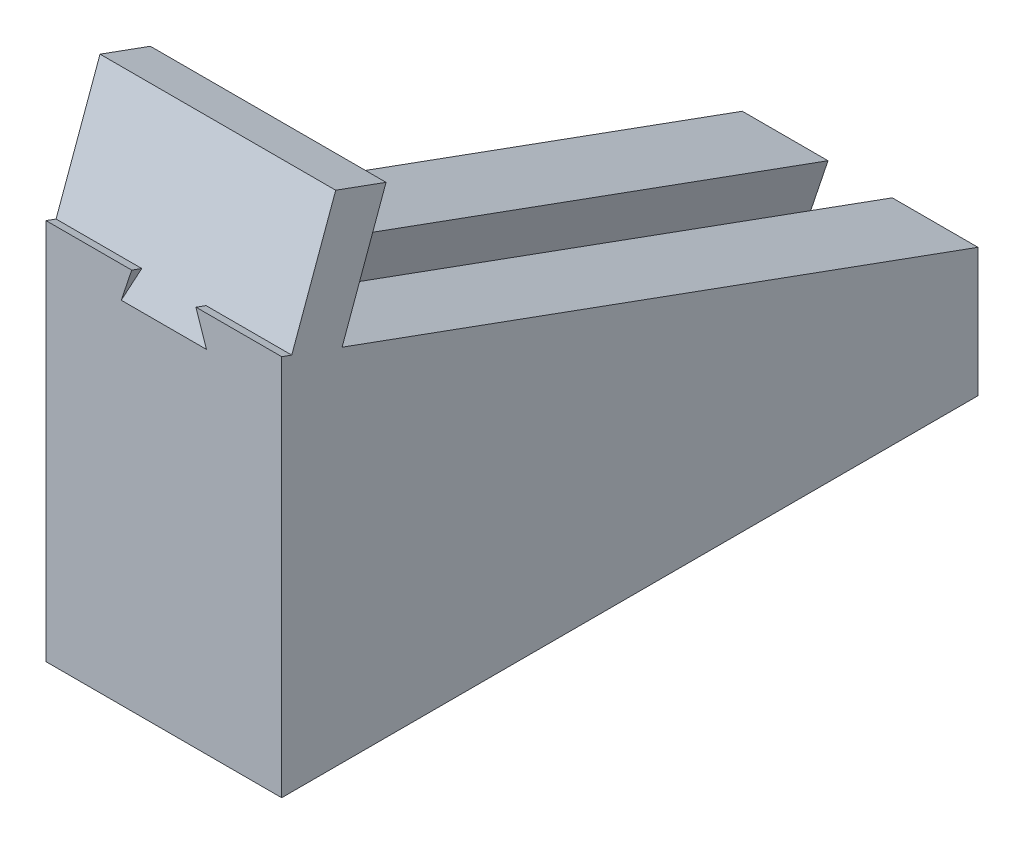
ISO-10303-21;
HEADER;
FILE_DESCRIPTION(('STEP AP214'),'2;1');
FILE_NAME('part.step','',(''),(''),'','','');
FILE_SCHEMA(('AUTOMOTIVE_DESIGN { 1 0 10303 214 1 1 1 1 }'));
ENDSEC;
DATA;
#1=APPLICATION_CONTEXT('core data for automotive mechanical design processes');
#2=APPLICATION_PROTOCOL_DEFINITION('international standard','automotive_design',2000,#1);
#3=PRODUCT_CONTEXT('',#1,'mechanical');
#4=PRODUCT('Part','Part','',(#3));
#5=PRODUCT_RELATED_PRODUCT_CATEGORY('part','',(#4));
#6=PRODUCT_DEFINITION_FORMATION('','',#4);
#7=PRODUCT_DEFINITION_CONTEXT('part definition',#1,'design');
#8=PRODUCT_DEFINITION('design','',#6,#7);
#9=PRODUCT_DEFINITION_SHAPE('','',#8);
#10=(LENGTH_UNIT() NAMED_UNIT(*) SI_UNIT(.MILLI.,.METRE.));
#11=(NAMED_UNIT(*) PLANE_ANGLE_UNIT() SI_UNIT($,.RADIAN.));
#12=(NAMED_UNIT(*) SI_UNIT($,.STERADIAN.) SOLID_ANGLE_UNIT());
#13=UNCERTAINTY_MEASURE_WITH_UNIT(LENGTH_MEASURE(1.E-05),#10,'distance_accuracy_value','');
#14=(GEOMETRIC_REPRESENTATION_CONTEXT(3) GLOBAL_UNCERTAINTY_ASSIGNED_CONTEXT((#13)) GLOBAL_UNIT_ASSIGNED_CONTEXT((#10,
#11,#12)) REPRESENTATION_CONTEXT('',''));
#15=CARTESIAN_POINT('',(0.,0.,0.));
#16=DIRECTION('',(0.,0.,1.));
#17=DIRECTION('',(1.,0.,0.));
#18=AXIS2_PLACEMENT_3D('',#15,#16,#17);
#19=CARTESIAN_POINT('',(-11.,4.71740096382081,-1.71699353392943));
#20=DIRECTION('',(0.,0.939692620785911,-0.342020143325662));
#21=DIRECTION('',(0.,0.342020143325662,0.939692620785911));
#22=AXIS2_PLACEMENT_3D('',#19,#20,#21);
#23=PLANE('',#22);
#24=DIRECTION('',(1.,0.,0.));
#25=VECTOR('',#24,1.);
#26=CARTESIAN_POINT('',(-11.,7.87507660337747,6.95864898371458));
#27=LINE('',#26,#25);
#28=CARTESIAN_POINT('',(-4.,7.87507660337739,6.95864898371461));
#29=VERTEX_POINT('',#28);
#30=CARTESIAN_POINT('',(0.,7.87507660337747,6.95864898371458));
#31=VERTEX_POINT('',#30);
#32=EDGE_CURVE('E150',#29,#31,#27,.T.);
#33=ORIENTED_EDGE('',*,*,#32,.F.);
#34=DIRECTION('',(0.,0.342020143325663,0.939692620785911));
#35=VECTOR('',#34,1.);
#36=CARTESIAN_POINT('',(-4.,-4.1473175071279,-26.0726073626836));
#37=LINE('',#36,#35);
#38=CARTESIAN_POINT('',(-4.,8.04608667504022,7.42849529410753));
#39=VERTEX_POINT('',#38);
#40=EDGE_CURVE('E184',#29,#39,#37,.T.);
#41=ORIENTED_EDGE('',*,*,#40,.T.);
#42=DIRECTION('',(1.,0.,0.));
#43=VECTOR('',#42,1.);
#44=CARTESIAN_POINT('',(-11.,8.0460866750403,7.42849529410754));
#45=LINE('',#44,#43);
#46=CARTESIAN_POINT('',(0.,8.0460866750403,7.42849529410754));
#47=VERTEX_POINT('',#46);
#48=EDGE_CURVE('E219',#39,#47,#45,.T.);
#49=ORIENTED_EDGE('',*,*,#48,.T.);
#50=DIRECTION('',(0.,0.342020143325662,0.939692620785911));
#51=VECTOR('',#50,1.);
#52=CARTESIAN_POINT('',(0.,4.71740096382081,-1.71699353392943));
#53=LINE('',#52,#51);
#54=EDGE_CURVE('E187',#31,#47,#53,.T.);
#55=ORIENTED_EDGE('',*,*,#54,.F.);
#56=EDGE_LOOP('',(#33,#41,#49,#55));
#57=FACE_BOUND('',#56,.T.);
#58=ADVANCED_FACE('F37',(#57),#23,.T.);
#59=DIRECTION('',(1.,0.,0.));
#60=VECTOR('',#59,1.);
#61=CARTESIAN_POINT('',(-11.,7.87507660337747,6.95864898371458));
#62=LINE('',#61,#60);
#63=CARTESIAN_POINT('',(-11.,7.87507660337747,6.95864898371458));
#64=VERTEX_POINT('',#63);
#65=CARTESIAN_POINT('',(-7.,7.8750766033774,6.95864898371461));
#66=VERTEX_POINT('',#65);
#67=EDGE_CURVE('E179',#64,#66,#62,.T.);
#68=ORIENTED_EDGE('',*,*,#67,.F.);
#69=DIRECTION('',(0.,0.342020143325662,0.939692620785911));
#70=VECTOR('',#69,1.);
#71=CARTESIAN_POINT('',(-11.,4.71740096382081,-1.71699353392943));
#72=LINE('',#71,#70);
#73=CARTESIAN_POINT('',(-11.,8.0460866750403,7.42849529410754));
#74=VERTEX_POINT('',#73);
#75=EDGE_CURVE('E211',#64,#74,#72,.T.);
#76=ORIENTED_EDGE('',*,*,#75,.T.);
#77=CARTESIAN_POINT('',(-7.,8.0460866750403,7.42849529410754));
#78=VERTEX_POINT('',#77);
#79=EDGE_CURVE('E239',#74,#78,#45,.T.);
#80=ORIENTED_EDGE('',*,*,#79,.T.);
#81=DIRECTION('',(0.,0.342020143325663,0.939692620785911));
#82=VECTOR('',#81,1.);
#83=CARTESIAN_POINT('',(-7.,-4.1473175071279,-26.0726073626836));
#84=LINE('',#83,#82);
#85=EDGE_CURVE('E197',#66,#78,#84,.T.);
#86=ORIENTED_EDGE('',*,*,#85,.F.);
#87=EDGE_LOOP('',(#68,#76,#80,#86));
#88=FACE_BOUND('',#87,.T.);
#89=ADVANCED_FACE('F294',(#88),#23,.T.);
#90=CARTESIAN_POINT('',(-4.,-4.1473175071279,-26.0726073626836));
#91=DIRECTION('',(-0.942461240687015,-0.314153746895672,0.114342612853221));
#92=DIRECTION('',(0.316227766016838,-0.948683298050514,0.));
#93=AXIS2_PLACEMENT_3D('',#90,#91,#92);
#94=PLANE('',#93);
#95=DIRECTION('',(-0.334315434586397,0.885623873250323,-0.322340728618655));
#96=VECTOR('',#95,1.);
#97=CARTESIAN_POINT('',(-4.,7.8750766033774,6.9586489837146));
#98=LINE('',#97,#96);
#99=CARTESIAN_POINT('',(-3.51269926663951,6.58418447495873,7.42849529410754));
#100=VERTEX_POINT('',#99);
#101=EDGE_CURVE('E181',#100,#29,#98,.T.);
#102=ORIENTED_EDGE('',*,*,#101,.F.);
#103=DIRECTION('',(0.316227766016838,-0.948683298050514,0.));
#104=VECTOR('',#103,1.);
#105=CARTESIAN_POINT('',(-2.28617399748793,2.90460866750402,7.42849529410753));
#106=LINE('',#105,#104);
#107=EDGE_CURVE('E243',#39,#100,#106,.T.);
#108=ORIENTED_EDGE('',*,*,#107,.F.);
#109=ORIENTED_EDGE('',*,*,#40,.F.);
#110=EDGE_LOOP('',(#102,#108,#109));
#111=FACE_BOUND('',#110,.T.);
#112=ADVANCED_FACE('F292',(#111),#94,.T.);
#113=CARTESIAN_POINT('',(-8.,-7.1473175071279,-26.0726073626836));
#114=DIRECTION('',(0.942461240687016,-0.314153746895672,0.114342612853221));
#115=DIRECTION('',(0.316227766016838,0.948683298050514,0.));
#116=AXIS2_PLACEMENT_3D('',#113,#114,#115);
#117=PLANE('',#116);
#118=DIRECTION('',(-0.334315434586397,-0.885623873250323,0.322340728618655));
#119=VECTOR('',#118,1.);
#120=CARTESIAN_POINT('',(-8.,5.22600993869892,7.9228303982444));
#121=LINE('',#120,#119);
#122=CARTESIAN_POINT('',(-7.4873007333605,6.58418447495873,7.42849529410754));
#123=VERTEX_POINT('',#122);
#124=EDGE_CURVE('E11',#66,#123,#121,.T.);
#125=ORIENTED_EDGE('',*,*,#124,.F.);
#126=ORIENTED_EDGE('',*,*,#85,.T.);
#127=DIRECTION('',(0.316227766016838,0.948683298050514,0.));
#128=VECTOR('',#127,1.);
#129=CARTESIAN_POINT('',(-9.81382600251207,-0.39539133249598,7.42849529410753));
#130=LINE('',#129,#128);
#131=EDGE_CURVE('E56',#123,#78,#130,.T.);
#132=ORIENTED_EDGE('',*,*,#131,.F.);
#133=EDGE_LOOP('',(#125,#126,#132));
#134=FACE_BOUND('',#133,.T.);
#135=ADVANCED_FACE('F290',(#134),#117,.T.);
#136=DIRECTION('',(-1.,0.,0.));
#137=VECTOR('',#136,1.);
#138=CARTESIAN_POINT('',(-11.,7.02002624506331,4.6094174317498));
#139=LINE('',#138,#137);
#140=CARTESIAN_POINT('',(0.,7.02002624506331,4.6094174317498));
#141=VERTEX_POINT('',#140);
#142=CARTESIAN_POINT('',(-4.,7.02002624506324,4.60941743174984));
#143=VERTEX_POINT('',#142);
#144=EDGE_CURVE('E177',#141,#143,#139,.T.);
#145=ORIENTED_EDGE('',*,*,#144,.F.);
#146=CARTESIAN_POINT('',(0.,-3.78294593861103,-25.0715047058925));
#147=VERTEX_POINT('',#146);
#148=EDGE_CURVE('E220',#147,#141,#53,.T.);
#149=ORIENTED_EDGE('',*,*,#148,.F.);
#150=DIRECTION('',(1.,0.,0.));
#151=VECTOR('',#150,1.);
#152=CARTESIAN_POINT('',(-11.,-3.78294593861103,-25.0715047058925));
#153=LINE('',#152,#151);
#154=CARTESIAN_POINT('',(-4.,-3.78294593861112,-25.0715047058925));
#155=VERTEX_POINT('',#154);
#156=EDGE_CURVE('E233',#155,#147,#153,.T.);
#157=ORIENTED_EDGE('',*,*,#156,.F.);
#158=EDGE_CURVE('E204',#155,#143,#37,.T.);
#159=ORIENTED_EDGE('',*,*,#158,.T.);
#160=EDGE_LOOP('',(#145,#149,#157,#159));
#161=FACE_BOUND('',#160,.T.);
#162=ADVANCED_FACE('F39',(#161),#23,.T.);
#163=DIRECTION('',(-1.,0.,0.));
#164=VECTOR('',#163,1.);
#165=CARTESIAN_POINT('',(-11.,7.02002624506331,4.6094174317498));
#166=LINE('',#165,#164);
#167=CARTESIAN_POINT('',(-7.,7.02002624506324,4.60941743174983));
#168=VERTEX_POINT('',#167);
#169=CARTESIAN_POINT('',(-11.,7.02002624506331,4.6094174317498));
#170=VERTEX_POINT('',#169);
#171=EDGE_CURVE('E175',#168,#170,#166,.T.);
#172=ORIENTED_EDGE('',*,*,#171,.F.);
#173=CARTESIAN_POINT('',(-7.,-3.78294593861112,-25.0715047058925));
#174=VERTEX_POINT('',#173);
#175=EDGE_CURVE('E194',#174,#168,#84,.T.);
#176=ORIENTED_EDGE('',*,*,#175,.F.);
#177=CARTESIAN_POINT('',(-11.,-3.78294593861103,-25.0715047058925));
#178=VERTEX_POINT('',#177);
#179=EDGE_CURVE('E230',#178,#174,#153,.T.);
#180=ORIENTED_EDGE('',*,*,#179,.F.);
#181=EDGE_CURVE('E207',#178,#170,#72,.T.);
#182=ORIENTED_EDGE('',*,*,#181,.T.);
#183=EDGE_LOOP('',(#172,#176,#180,#182));
#184=FACE_BOUND('',#183,.T.);
#185=ADVANCED_FACE('F254',(#184),#23,.T.);
#186=CARTESIAN_POINT('',(-11.,0.,-25.0715047058925));
#187=DIRECTION('',(0.,0.,-1.));
#188=DIRECTION('',(-1.,0.,0.));
#189=AXIS2_PLACEMENT_3D('',#186,#187,#188);
#190=PLANE('',#189);
#191=DIRECTION('',(-1.,0.,0.));
#192=VECTOR('',#191,1.);
#193=CARTESIAN_POINT('',(-3.,-6.78294593861112,-25.0715047058925));
#194=LINE('',#193,#192);
#195=CARTESIAN_POINT('',(-3.,-6.78294593861112,-25.0715047058925));
#196=VERTEX_POINT('',#195);
#197=CARTESIAN_POINT('',(-8.,-6.78294593861111,-25.0715047058925));
#198=VERTEX_POINT('',#197);
#199=EDGE_CURVE('E188',#196,#198,#194,.T.);
#200=ORIENTED_EDGE('',*,*,#199,.F.);
#201=DIRECTION('',(0.316227766016838,-0.948683298050514,0.));
#202=VECTOR('',#201,1.);
#203=CARTESIAN_POINT('',(-3.89068852944496,-4.11088035027622,-25.0715047058925));
#204=LINE('',#203,#202);
#205=EDGE_CURVE('E191',#155,#196,#204,.T.);
#206=ORIENTED_EDGE('',*,*,#205,.F.);
#207=ORIENTED_EDGE('',*,*,#156,.T.);
#208=DIRECTION('',(0.,1.,0.));
#209=VECTOR('',#208,1.);
#210=CARTESIAN_POINT('',(0.,0.,-25.0715047058925));
#211=LINE('',#210,#209);
#212=CARTESIAN_POINT('',(0.,-9.78294593861103,-25.0715047058925));
#213=VERTEX_POINT('',#212);
#214=EDGE_CURVE('E227',#213,#147,#211,.T.);
#215=ORIENTED_EDGE('',*,*,#214,.F.);
#216=DIRECTION('',(1.,0.,0.));
#217=VECTOR('',#216,1.);
#218=CARTESIAN_POINT('',(-11.,-9.78294593861103,-25.0715047058925));
#219=LINE('',#218,#217);
#220=CARTESIAN_POINT('',(-11.,-9.78294593861103,-25.0715047058925));
#221=VERTEX_POINT('',#220);
#222=EDGE_CURVE('E234',#221,#213,#219,.T.);
#223=ORIENTED_EDGE('',*,*,#222,.F.);
#224=DIRECTION('',(0.,1.,0.));
#225=VECTOR('',#224,1.);
#226=CARTESIAN_POINT('',(-11.,0.,-25.0715047058925));
#227=LINE('',#226,#225);
#228=EDGE_CURVE('E216',#221,#178,#227,.T.);
#229=ORIENTED_EDGE('',*,*,#228,.T.);
#230=ORIENTED_EDGE('',*,*,#179,.T.);
#231=DIRECTION('',(0.316227766016838,0.948683298050514,0.));
#232=VECTOR('',#231,1.);
#233=CARTESIAN_POINT('',(-8.10931147055504,-7.11088035027622,-25.0715047058925));
#234=LINE('',#233,#232);
#235=EDGE_CURVE('E185',#198,#174,#234,.T.);
#236=ORIENTED_EDGE('',*,*,#235,.F.);
#237=EDGE_LOOP('',(#200,#206,#207,#215,#223,#229,#230,#236));
#238=FACE_BOUND('',#237,.T.);
#239=ADVANCED_FACE('F260',(#238),#190,.T.);
#240=CARTESIAN_POINT('',(-11.,0.,7.42849529410753));
#241=DIRECTION('',(0.,0.,1.));
#242=DIRECTION('',(0.,-1.,0.));
#243=AXIS2_PLACEMENT_3D('',#240,#241,#242);
#244=PLANE('',#243);
#245=DIRECTION('',(1.,0.,0.));
#246=VECTOR('',#245,1.);
#247=CARTESIAN_POINT('',(-11.,-9.78294593861103,7.42849529410753));
#248=LINE('',#247,#246);
#249=CARTESIAN_POINT('',(-11.,-9.78294593861103,7.42849529410753));
#250=VERTEX_POINT('',#249);
#251=CARTESIAN_POINT('',(0.,-9.78294593861103,7.42849529410753));
#252=VERTEX_POINT('',#251);
#253=EDGE_CURVE('E236',#250,#252,#248,.T.);
#254=ORIENTED_EDGE('',*,*,#253,.T.);
#255=DIRECTION('',(0.,-1.,0.));
#256=VECTOR('',#255,1.);
#257=CARTESIAN_POINT('',(0.,0.,7.42849529410753));
#258=LINE('',#257,#256);
#259=EDGE_CURVE('E222',#47,#252,#258,.T.);
#260=ORIENTED_EDGE('',*,*,#259,.F.);
#261=ORIENTED_EDGE('',*,*,#48,.F.);
#262=ORIENTED_EDGE('',*,*,#107,.T.);
#263=DIRECTION('',(-1.,0.,0.));
#264=VECTOR('',#263,1.);
#265=CARTESIAN_POINT('',(10.5093867219629,6.58418447495873,7.42849529410754));
#266=LINE('',#265,#264);
#267=EDGE_CURVE('E52',#100,#123,#266,.T.);
#268=ORIENTED_EDGE('',*,*,#267,.T.);
#269=ORIENTED_EDGE('',*,*,#131,.T.);
#270=ORIENTED_EDGE('',*,*,#79,.F.);
#271=DIRECTION('',(0.,-1.,0.));
#272=VECTOR('',#271,1.);
#273=CARTESIAN_POINT('',(-11.,0.,7.42849529410753));
#274=LINE('',#273,#272);
#275=EDGE_CURVE('E210',#74,#250,#274,.T.);
#276=ORIENTED_EDGE('',*,*,#275,.T.);
#277=EDGE_LOOP('',(#254,#260,#261,#262,#268,#269,#270,#276));
#278=FACE_BOUND('',#277,.T.);
#279=ADVANCED_FACE('F369',(#278),#244,.T.);
#280=CARTESIAN_POINT('',(-11.,-9.78294593861103,0.));
#281=DIRECTION('',(0.,-1.,0.));
#282=DIRECTION('',(0.,0.,-1.));
#283=AXIS2_PLACEMENT_3D('',#280,#281,#282);
#284=PLANE('',#283);
#285=DIRECTION('',(0.,0.,-1.));
#286=VECTOR('',#285,1.);
#287=CARTESIAN_POINT('',(0.,-9.78294593861103,0.));
#288=LINE('',#287,#286);
#289=EDGE_CURVE('E224',#252,#213,#288,.T.);
#290=ORIENTED_EDGE('',*,*,#289,.F.);
#291=ORIENTED_EDGE('',*,*,#253,.F.);
#292=DIRECTION('',(0.,0.,-1.));
#293=VECTOR('',#292,1.);
#294=CARTESIAN_POINT('',(-11.,-9.78294593861103,0.));
#295=LINE('',#294,#293);
#296=EDGE_CURVE('E213',#250,#221,#295,.T.);
#297=ORIENTED_EDGE('',*,*,#296,.T.);
#298=ORIENTED_EDGE('',*,*,#222,.T.);
#299=EDGE_LOOP('',(#290,#291,#297,#298));
#300=FACE_BOUND('',#299,.T.);
#301=ADVANCED_FACE('F361',(#300),#284,.T.);
#302=CARTESIAN_POINT('',(-11.,0.,0.));
#303=DIRECTION('',(1.,0.,0.));
#304=DIRECTION('',(0.,0.,-1.));
#305=AXIS2_PLACEMENT_3D('',#302,#303,#304);
#306=PLANE('',#305);
#307=ORIENTED_EDGE('',*,*,#75,.F.);
#308=DIRECTION('',(0.,0.939692620785911,-0.342020143325663));
#309=VECTOR('',#308,1.);
#310=CARTESIAN_POINT('',(-11.,13.5132323280929,4.90652812376061));
#311=LINE('',#310,#309);
#312=CARTESIAN_POINT('',(-11.,13.5132323280929,4.90652812376061));
#313=VERTEX_POINT('',#312);
#314=EDGE_CURVE('E268',#64,#313,#311,.T.);
#315=ORIENTED_EDGE('',*,*,#314,.T.);
#316=DIRECTION('',(0.,-0.342020143325664,-0.93969262078591));
#317=VECTOR('',#316,1.);
#318=CARTESIAN_POINT('',(-11.,12.6581819697788,2.55729657179583));
#319=LINE('',#318,#317);
#320=CARTESIAN_POINT('',(-11.,12.6581819697788,2.55729657179583));
#321=VERTEX_POINT('',#320);
#322=EDGE_CURVE('E166',#313,#321,#319,.T.);
#323=ORIENTED_EDGE('',*,*,#322,.T.);
#324=DIRECTION('',(0.,-0.939692620785911,0.342020143325662));
#325=VECTOR('',#324,1.);
#326=CARTESIAN_POINT('',(-11.,4.20094838270558,5.63547786172679));
#327=LINE('',#326,#325);
#328=EDGE_CURVE('E153',#321,#170,#327,.T.);
#329=ORIENTED_EDGE('',*,*,#328,.T.);
#330=ORIENTED_EDGE('',*,*,#181,.F.);
#331=ORIENTED_EDGE('',*,*,#228,.F.);
#332=ORIENTED_EDGE('',*,*,#296,.F.);
#333=ORIENTED_EDGE('',*,*,#275,.F.);
#334=EDGE_LOOP('',(#307,#315,#323,#329,#330,#331,#332,#333));
#335=FACE_BOUND('',#334,.T.);
#336=ADVANCED_FACE('F265',(#335),#306,.F.);
#337=CARTESIAN_POINT('',(0.,0.,0.));
#338=DIRECTION('',(1.,0.,0.));
#339=DIRECTION('',(0.,0.,-1.));
#340=AXIS2_PLACEMENT_3D('',#337,#338,#339);
#341=PLANE('',#340);
#342=ORIENTED_EDGE('',*,*,#148,.T.);
#343=DIRECTION('',(0.,-0.939692620785911,0.342020143325662));
#344=VECTOR('',#343,1.);
#345=CARTESIAN_POINT('',(0.,4.20094838270558,5.63547786172679));
#346=LINE('',#345,#344);
#347=CARTESIAN_POINT('',(0.,12.6581819697788,2.55729657179583));
#348=VERTEX_POINT('',#347);
#349=EDGE_CURVE('E159',#348,#141,#346,.T.);
#350=ORIENTED_EDGE('',*,*,#349,.F.);
#351=DIRECTION('',(0.,-0.342020143325664,-0.93969262078591));
#352=VECTOR('',#351,1.);
#353=CARTESIAN_POINT('',(0.,12.6581819697788,2.55729657179583));
#354=LINE('',#353,#352);
#355=CARTESIAN_POINT('',(0.,13.5132323280929,4.90652812376061));
#356=VERTEX_POINT('',#355);
#357=EDGE_CURVE('E156',#356,#348,#354,.T.);
#358=ORIENTED_EDGE('',*,*,#357,.F.);
#359=DIRECTION('',(0.,0.939692620785911,-0.342020143325663));
#360=VECTOR('',#359,1.);
#361=CARTESIAN_POINT('',(0.,13.5132323280929,4.90652812376061));
#362=LINE('',#361,#360);
#363=EDGE_CURVE('E143',#31,#356,#362,.T.);
#364=ORIENTED_EDGE('',*,*,#363,.F.);
#365=ORIENTED_EDGE('',*,*,#54,.T.);
#366=ORIENTED_EDGE('',*,*,#259,.T.);
#367=ORIENTED_EDGE('',*,*,#289,.T.);
#368=ORIENTED_EDGE('',*,*,#214,.T.);
#369=EDGE_LOOP('',(#342,#350,#358,#364,#365,#366,#367,#368));
#370=FACE_BOUND('',#369,.T.);
#371=ADVANCED_FACE('F158',(#370),#341,.T.);
#372=DIRECTION('',(0.334315434586397,-0.885623873250323,0.322340728618654));
#373=VECTOR('',#372,1.);
#374=CARTESIAN_POINT('',(-4.,7.02002624506323,4.60941743174984));
#375=LINE('',#374,#373);
#376=CARTESIAN_POINT('',(-3.,4.37095958038476,5.57359884627963));
#377=VERTEX_POINT('',#376);
#378=EDGE_CURVE('E173',#143,#377,#375,.T.);
#379=ORIENTED_EDGE('',*,*,#378,.F.);
#380=ORIENTED_EDGE('',*,*,#158,.F.);
#381=ORIENTED_EDGE('',*,*,#205,.T.);
#382=DIRECTION('',(0.,0.342020143325663,0.939692620785911));
#383=VECTOR('',#382,1.);
#384=CARTESIAN_POINT('',(-3.,-7.1473175071279,-26.0726073626836));
#385=LINE('',#384,#383);
#386=EDGE_CURVE('E201',#196,#377,#385,.T.);
#387=ORIENTED_EDGE('',*,*,#386,.T.);
#388=EDGE_LOOP('',(#379,#380,#381,#387));
#389=FACE_BOUND('',#388,.T.);
#390=ADVANCED_FACE('F280',(#389),#94,.T.);
#391=CARTESIAN_POINT('',(-3.,-7.1473175071279,-26.0726073626836));
#392=DIRECTION('',(0.,0.939692620785911,-0.342020143325663));
#393=DIRECTION('',(0.,0.342020143325663,0.939692620785911));
#394=AXIS2_PLACEMENT_3D('',#391,#392,#393);
#395=PLANE('',#394);
#396=DIRECTION('',(-1.,0.,0.));
#397=VECTOR('',#396,1.);
#398=CARTESIAN_POINT('',(-3.,4.37095958038476,5.57359884627963));
#399=LINE('',#398,#397);
#400=CARTESIAN_POINT('',(-8.,4.37095958038477,5.57359884627963));
#401=VERTEX_POINT('',#400);
#402=EDGE_CURVE('E171',#377,#401,#399,.T.);
#403=ORIENTED_EDGE('',*,*,#402,.F.);
#404=ORIENTED_EDGE('',*,*,#386,.F.);
#405=ORIENTED_EDGE('',*,*,#199,.T.);
#406=DIRECTION('',(0.,0.342020143325663,0.939692620785911));
#407=VECTOR('',#406,1.);
#408=CARTESIAN_POINT('',(-8.,-7.1473175071279,-26.0726073626836));
#409=LINE('',#408,#407);
#410=EDGE_CURVE('E198',#198,#401,#409,.T.);
#411=ORIENTED_EDGE('',*,*,#410,.T.);
#412=EDGE_LOOP('',(#403,#404,#405,#411));
#413=FACE_BOUND('',#412,.T.);
#414=ADVANCED_FACE('F282',(#413),#395,.T.);
#415=DIRECTION('',(0.334315434586397,0.885623873250323,-0.322340728618655));
#416=VECTOR('',#415,1.);
#417=CARTESIAN_POINT('',(-8.,4.37095958038476,5.57359884627963));
#418=LINE('',#417,#416);
#419=EDGE_CURVE('E45',#401,#168,#418,.T.);
#420=ORIENTED_EDGE('',*,*,#419,.F.);
#421=ORIENTED_EDGE('',*,*,#410,.F.);
#422=ORIENTED_EDGE('',*,*,#235,.T.);
#423=ORIENTED_EDGE('',*,*,#175,.T.);
#424=EDGE_LOOP('',(#420,#421,#422,#423));
#425=FACE_BOUND('',#424,.T.);
#426=ADVANCED_FACE('F256',(#425),#117,.T.);
#427=CARTESIAN_POINT('',(10.5093867219629,13.5132323280929,4.90652812376061));
#428=DIRECTION('',(0.,0.342020143325663,0.939692620785911));
#429=DIRECTION('',(0.,-0.939692620785911,0.342020143325663));
#430=AXIS2_PLACEMENT_3D('',#427,#428,#429);
#431=PLANE('',#430);
#432=ORIENTED_EDGE('',*,*,#101,.T.);
#433=ORIENTED_EDGE('',*,*,#32,.T.);
#434=ORIENTED_EDGE('',*,*,#363,.T.);
#435=DIRECTION('',(-1.,0.,0.));
#436=VECTOR('',#435,1.);
#437=CARTESIAN_POINT('',(10.5093867219629,13.5132323280929,4.90652812376061));
#438=LINE('',#437,#436);
#439=EDGE_CURVE('E147',#356,#313,#438,.T.);
#440=ORIENTED_EDGE('',*,*,#439,.T.);
#441=ORIENTED_EDGE('',*,*,#314,.F.);
#442=ORIENTED_EDGE('',*,*,#67,.T.);
#443=ORIENTED_EDGE('',*,*,#124,.T.);
#444=ORIENTED_EDGE('',*,*,#267,.F.);
#445=EDGE_LOOP('',(#432,#433,#434,#440,#441,#442,#443,#444));
#446=FACE_BOUND('',#445,.T.);
#447=ADVANCED_FACE('F145',(#446),#431,.T.);
#448=CARTESIAN_POINT('',(10.5093867219629,12.6581819697788,2.55729657179583));
#449=DIRECTION('',(0.,0.93969262078591,-0.342020143325664));
#450=DIRECTION('',(0.,0.342020143325664,0.93969262078591));
#451=AXIS2_PLACEMENT_3D('',#448,#449,#450);
#452=PLANE('',#451);
#453=ORIENTED_EDGE('',*,*,#439,.F.);
#454=ORIENTED_EDGE('',*,*,#357,.T.);
#455=DIRECTION('',(-1.,0.,0.));
#456=VECTOR('',#455,1.);
#457=CARTESIAN_POINT('',(10.5093867219629,12.6581819697788,2.55729657179583));
#458=LINE('',#457,#456);
#459=EDGE_CURVE('E162',#348,#321,#458,.T.);
#460=ORIENTED_EDGE('',*,*,#459,.T.);
#461=ORIENTED_EDGE('',*,*,#322,.F.);
#462=EDGE_LOOP('',(#453,#454,#460,#461));
#463=FACE_BOUND('',#462,.T.);
#464=ADVANCED_FACE('F164',(#463),#452,.T.);
#465=CARTESIAN_POINT('',(10.5093867219629,4.20094838270558,5.63547786172679));
#466=DIRECTION('',(0.,-0.342020143325662,-0.939692620785911));
#467=DIRECTION('',(0.,0.939692620785911,-0.342020143325662));
#468=AXIS2_PLACEMENT_3D('',#465,#466,#467);
#469=PLANE('',#468);
#470=ORIENTED_EDGE('',*,*,#349,.T.);
#471=ORIENTED_EDGE('',*,*,#144,.T.);
#472=ORIENTED_EDGE('',*,*,#378,.T.);
#473=ORIENTED_EDGE('',*,*,#402,.T.);
#474=ORIENTED_EDGE('',*,*,#419,.T.);
#475=ORIENTED_EDGE('',*,*,#171,.T.);
#476=ORIENTED_EDGE('',*,*,#328,.F.);
#477=ORIENTED_EDGE('',*,*,#459,.F.);
#478=EDGE_LOOP('',(#470,#471,#472,#473,#474,#475,#476,#477));
#479=FACE_BOUND('',#478,.T.);
#480=ADVANCED_FACE('F247',(#479),#469,.T.);
#481=CLOSED_SHELL('',(#58,#89,#112,#135,#162,#185,#239,#279,#301,#336,#371,#390,#414,#426,#447,
#464,#480));
#482=MANIFOLD_SOLID_BREP('B2',#481);
#483=ADVANCED_BREP_SHAPE_REPRESENTATION('',(#18,#482),#14);
#484=SHAPE_DEFINITION_REPRESENTATION(#9,#483);
ENDSEC;
END-ISO-10303-21;
